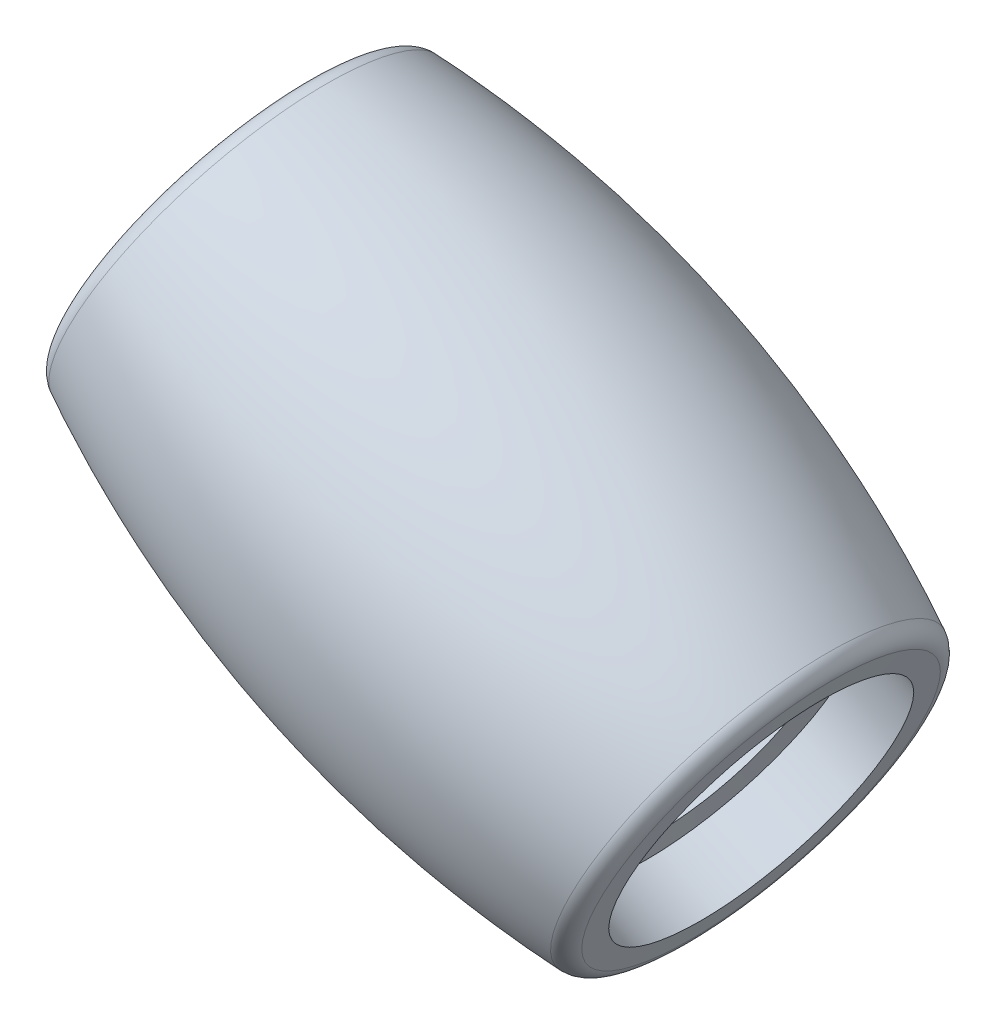
ISO-10303-21;
HEADER;
FILE_DESCRIPTION(('STEP AP214'),'2;1');
FILE_NAME('part.step','',(''),(''),'','','');
FILE_SCHEMA(('AUTOMOTIVE_DESIGN { 1 0 10303 214 1 1 1 1 }'));
ENDSEC;
DATA;
#1=APPLICATION_CONTEXT('core data for automotive mechanical design processes');
#2=APPLICATION_PROTOCOL_DEFINITION('international standard','automotive_design',2000,#1);
#3=PRODUCT_CONTEXT('',#1,'mechanical');
#4=PRODUCT('Part','Part','',(#3));
#5=PRODUCT_RELATED_PRODUCT_CATEGORY('part','',(#4));
#6=PRODUCT_DEFINITION_FORMATION('','',#4);
#7=PRODUCT_DEFINITION_CONTEXT('part definition',#1,'design');
#8=PRODUCT_DEFINITION('design','',#6,#7);
#9=PRODUCT_DEFINITION_SHAPE('','',#8);
#10=(LENGTH_UNIT() NAMED_UNIT(*) SI_UNIT(.MILLI.,.METRE.));
#11=(NAMED_UNIT(*) PLANE_ANGLE_UNIT() SI_UNIT($,.RADIAN.));
#12=(NAMED_UNIT(*) SI_UNIT($,.STERADIAN.) SOLID_ANGLE_UNIT());
#13=UNCERTAINTY_MEASURE_WITH_UNIT(LENGTH_MEASURE(1.E-05),#10,'distance_accuracy_value','');
#14=(GEOMETRIC_REPRESENTATION_CONTEXT(3) GLOBAL_UNCERTAINTY_ASSIGNED_CONTEXT((#13)) GLOBAL_UNIT_ASSIGNED_CONTEXT((#10,
#11,#12)) REPRESENTATION_CONTEXT('',''));
#15=CARTESIAN_POINT('',(0.,0.,0.));
#16=DIRECTION('',(0.,0.,1.));
#17=DIRECTION('',(1.,0.,0.));
#18=AXIS2_PLACEMENT_3D('',#15,#16,#17);
#19=CARTESIAN_POINT('',(-10.8636941727663,-21.4063109601022,0.));
#20=DIRECTION('',(0.900968867902419,-0.433883739117558,0.));
#21=DIRECTION('',(0.433883739117558,0.900968867902419,0.));
#22=AXIS2_PLACEMENT_3D('',#19,#20,#21);
#23=CONICAL_SURFACE('',#22,4.50000000006161,1.48352986419795);
#24=CARTESIAN_POINT('',(-10.8636941727726,-21.4063109600992,0.));
#25=DIRECTION('',(-0.900968867902419,0.433883739117558,0.));
#26=DIRECTION('',(-0.433883739117558,-0.900968867902419,0.));
#27=AXIS2_PLACEMENT_3D('',#24,#25,#26);
#28=CIRCLE('',#27,4.5);
#29=CARTESIAN_POINT('',(-12.8161709988016,-25.4606708656601,0.));
#30=VERTEX_POINT('',#29);
#31=EDGE_CURVE('E21',#30,#30,#28,.F.);
#32=ORIENTED_EDGE('',*,*,#31,.T.);
#33=EDGE_LOOP('',(#32));
#34=FACE_BOUND('',#33,.T.);
#35=CARTESIAN_POINT('',(-10.9819310159695,-21.3493710974077,0.));
#36=DIRECTION('',(-0.900968867902419,0.433883739117558,0.));
#37=DIRECTION('',(-0.433883739117558,-0.900968867902419,0.));
#38=AXIS2_PLACEMENT_3D('',#35,#36,#37);
#39=CIRCLE('',#38,3.);
#40=CARTESIAN_POINT('',(-12.2835822333222,-24.0522777011149,0.));
#41=VERTEX_POINT('',#40);
#42=EDGE_CURVE('E76',#41,#41,#39,.T.);
#43=ORIENTED_EDGE('',*,*,#42,.T.);
#44=EDGE_LOOP('',(#43));
#45=FACE_BOUND('',#44,.T.);
#46=ADVANCED_FACE('F17',(#34,#45),#23,.F.);
#47=CARTESIAN_POINT('',(-10.4132097388214,-21.623252829658,0.));
#48=DIRECTION('',(-0.900968867902419,0.433883739117558,0.));
#49=DIRECTION('',(-0.433883739117558,-0.900968867902419,0.));
#50=AXIS2_PLACEMENT_3D('',#47,#48,#49);
#51=CYLINDRICAL_SURFACE('',#50,4.5);
#52=CARTESIAN_POINT('',(-9.96272530487985,-21.8401946992121,0.));
#53=DIRECTION('',(-0.900968867902419,0.433883739117558,0.));
#54=DIRECTION('',(0.379720615811658,0.788497983452532,0.483821438155551));
#55=AXIS2_PLACEMENT_3D('',#52,#53,#54);
#56=CIRCLE('',#55,4.49999999995393);
#57=CARTESIAN_POINT('',(-8.25398253374487,-18.2919537737121,2.17719647167769));
#58=VERTEX_POINT('',#57);
#59=EDGE_CURVE('E74',#58,#58,#56,.F.);
#60=ORIENTED_EDGE('',*,*,#59,.T.);
#61=EDGE_LOOP('',(#60));
#62=FACE_BOUND('',#61,.T.);
#63=ORIENTED_EDGE('',*,*,#31,.F.);
#64=EDGE_LOOP('',(#63));
#65=FACE_BOUND('',#64,.T.);
#66=ADVANCED_FACE('F84',(#62,#65),#51,.F.);
#67=CARTESIAN_POINT('',(-12.2601959180214,-20.733791164467,0.));
#68=DIRECTION('',(-0.900968867902419,0.433883739117558,0.));
#69=DIRECTION('',(-0.433883739117558,-0.900968867902419,0.));
#70=AXIS2_PLACEMENT_3D('',#67,#68,#69);
#71=CYLINDRICAL_SURFACE('',#70,3.);
#72=ORIENTED_EDGE('',*,*,#42,.F.);
#73=EDGE_LOOP('',(#72));
#74=FACE_BOUND('',#73,.T.);
#75=CARTESIAN_POINT('',(-13.5384608200791,-20.1182112315235,0.));
#76=DIRECTION('',(-0.900968867902419,0.433883739117558,0.));
#77=DIRECTION('',(0.379720615811813,0.788497983452854,0.483821438154904));
#78=AXIS2_PLACEMENT_3D('',#75,#76,#77);
#79=CIRCLE('',#78,3.00000000001246);
#80=CARTESIAN_POINT('',(-12.3992989726389,-17.7527172811551,1.45146431447074));
#81=VERTEX_POINT('',#80);
#82=EDGE_CURVE('E71',#81,#81,#79,.T.);
#83=ORIENTED_EDGE('',*,*,#82,.T.);
#84=EDGE_LOOP('',(#83));
#85=FACE_BOUND('',#84,.T.);
#86=ADVANCED_FACE('F86',(#74,#85),#71,.F.);
#87=CARTESIAN_POINT('',(-9.96272530487985,-21.8401946992121,0.));
#88=DIRECTION('',(-0.900968867902419,0.433883739117558,0.));
#89=DIRECTION('',(-0.433883739117558,-0.900968867902419,0.));
#90=AXIS2_PLACEMENT_3D('',#87,#88,#89);
#91=CONICAL_SURFACE('',#90,4.49999999995394,1.48352986421008);
#92=ORIENTED_EDGE('',*,*,#59,.F.);
#93=EDGE_LOOP('',(#92));
#94=FACE_BOUND('',#93,.T.);
#95=CARTESIAN_POINT('',(-9.84448846167332,-21.8971345619083,0.));
#96=DIRECTION('',(-0.900968867902419,0.433883739117558,0.));
#97=DIRECTION('',(-0.433883739117558,-0.900968867902419,0.));
#98=AXIS2_PLACEMENT_3D('',#95,#96,#97);
#99=CIRCLE('',#98,3.);
#100=CARTESIAN_POINT('',(-11.146139679026,-24.6000411656156,0.));
#101=VERTEX_POINT('',#100);
#102=EDGE_CURVE('E68',#101,#101,#99,.F.);
#103=ORIENTED_EDGE('',*,*,#102,.T.);
#104=EDGE_LOOP('',(#103));
#105=FACE_BOUND('',#104,.T.);
#106=ADVANCED_FACE('F94',(#94,#105),#91,.F.);
#107=CARTESIAN_POINT('',(-13.6566976632872,-20.0612713688266,0.));
#108=DIRECTION('',(-0.900968867902419,0.433883739117558,0.));
#109=DIRECTION('',(-0.433883739117558,-0.900968867902419,0.));
#110=AXIS2_PLACEMENT_3D('',#107,#108,#109);
#111=CONICAL_SURFACE('',#110,4.50000000001495,1.4835298641935);
#112=CARTESIAN_POINT('',(-13.6566976632701,-20.0612713688348,0.));
#113=DIRECTION('',(-0.900968867902419,0.433883739117558,0.));
#114=DIRECTION('',(-0.433883739117558,-0.900968867902419,0.));
#115=AXIS2_PLACEMENT_3D('',#112,#113,#114);
#116=CIRCLE('',#115,4.5);
#117=CARTESIAN_POINT('',(-15.6091744892991,-24.1156312743957,0.));
#118=VERTEX_POINT('',#117);
#119=EDGE_CURVE('E65',#118,#118,#116,.T.);
#120=ORIENTED_EDGE('',*,*,#119,.T.);
#121=EDGE_LOOP('',(#120));
#122=FACE_BOUND('',#121,.T.);
#123=ORIENTED_EDGE('',*,*,#82,.F.);
#124=EDGE_LOOP('',(#123));
#125=FACE_BOUND('',#124,.T.);
#126=ADVANCED_FACE('F186',(#122,#125),#111,.F.);
#127=CARTESIAN_POINT('',(-8.56622355962145,-22.512714494849,0.));
#128=DIRECTION('',(-0.900968867902419,0.433883739117558,0.));
#129=DIRECTION('',(-0.433883739117558,-0.900968867902419,0.));
#130=AXIS2_PLACEMENT_3D('',#127,#128,#129);
#131=CYLINDRICAL_SURFACE('',#130,3.);
#132=ORIENTED_EDGE('',*,*,#102,.F.);
#133=EDGE_LOOP('',(#132));
#134=FACE_BOUND('',#133,.T.);
#135=CARTESIAN_POINT('',(-7.28795865756539,-23.1282944277917,0.));
#136=DIRECTION('',(0.900968867902419,-0.433883739117558,0.));
#137=DIRECTION('',(-0.379720615814094,-0.788497983457589,-0.483821438145397));
#138=AXIS2_PLACEMENT_3D('',#135,#136,#137);
#139=CIRCLE('',#138,2.9999999999539);
#140=CARTESIAN_POINT('',(-8.42712050499017,-25.4937883781281,-1.4514643144139));
#141=VERTEX_POINT('',#140);
#142=EDGE_CURVE('E57',#141,#141,#139,.T.);
#143=ORIENTED_EDGE('',*,*,#142,.T.);
#144=EDGE_LOOP('',(#143));
#145=FACE_BOUND('',#144,.T.);
#146=ADVANCED_FACE('F183',(#134,#145),#131,.F.);
#147=CARTESIAN_POINT('',(-14.1071820972213,-19.844329499276,0.));
#148=DIRECTION('',(-0.900968867902419,0.433883739117558,0.));
#149=DIRECTION('',(-0.433883739117558,-0.900968867902419,0.));
#150=AXIS2_PLACEMENT_3D('',#147,#148,#149);
#151=CYLINDRICAL_SURFACE('',#150,4.5);
#152=CARTESIAN_POINT('',(-14.5576665311737,-19.6273876297167,0.));
#153=DIRECTION('',(0.900968867902419,-0.433883739117558,0.));
#154=DIRECTION('',(-0.379720615814473,-0.788497983458377,-0.483821438143816));
#155=AXIS2_PLACEMENT_3D('',#152,#153,#154);
#156=CIRCLE('',#155,4.49999999994559);
#157=CARTESIAN_POINT('',(-16.2664093023842,-23.175628555363,-2.17719647172327));
#158=VERTEX_POINT('',#157);
#159=CARTESIAN_POINT('',(-12.8489237600541,-16.0791467042325,2.17719647162675));
#160=VERTEX_POINT('',#159);
#161=EDGE_CURVE('E47',#158,#160,#156,.F.);
#162=ORIENTED_EDGE('',*,*,#161,.T.);
#163=CARTESIAN_POINT('',(-14.5576665311737,-19.6273876297167,0.));
#164=DIRECTION('',(0.900968867902419,-0.433883739117558,0.));
#165=DIRECTION('',(-0.379720615814473,-0.788497983458377,-0.483821438143816));
#166=AXIS2_PLACEMENT_3D('',#163,#164,#165);
#167=CIRCLE('',#166,4.49999999994559);
#168=EDGE_CURVE('E42',#160,#158,#167,.F.);
#169=ORIENTED_EDGE('',*,*,#168,.T.);
#170=EDGE_LOOP('',(#162,#169));
#171=FACE_BOUND('',#170,.T.);
#172=ORIENTED_EDGE('',*,*,#119,.F.);
#173=EDGE_LOOP('',(#172));
#174=FACE_BOUND('',#173,.T.);
#175=ADVANCED_FACE('F55',(#171,#174),#151,.F.);
#176=CARTESIAN_POINT('',(-7.16972181438121,-23.1852342904771,0.));
#177=DIRECTION('',(0.900968867902419,-0.433883739117558,0.));
#178=DIRECTION('',(0.433883739117558,0.900968867902419,0.));
#179=AXIS2_PLACEMENT_3D('',#176,#177,#178);
#180=CONICAL_SURFACE('',#179,4.5000000000778,1.48352986421167);
#181=ORIENTED_EDGE('',*,*,#142,.F.);
#182=EDGE_LOOP('',(#181));
#183=FACE_BOUND('',#182,.T.);
#184=CARTESIAN_POINT('',(-7.16972181437269,-23.1852342904812,0.));
#185=DIRECTION('',(-0.900968867902419,0.433883739117558,0.));
#186=DIRECTION('',(-0.433883739117558,-0.900968867902419,0.));
#187=AXIS2_PLACEMENT_3D('',#184,#185,#186);
#188=CIRCLE('',#187,4.5);
#189=CARTESIAN_POINT('',(-9.1221986404017,-27.2395941960421,0.));
#190=VERTEX_POINT('',#189);
#191=EDGE_CURVE('E155',#190,#190,#188,.F.);
#192=ORIENTED_EDGE('',*,*,#191,.T.);
#193=EDGE_LOOP('',(#192));
#194=FACE_BOUND('',#193,.T.);
#195=ADVANCED_FACE('F159',(#183,#194),#180,.F.);
#196=CARTESIAN_POINT('',(-14.5576665311523,-19.627387629727,0.));
#197=DIRECTION('',(0.900968867902419,-0.433883739117558,0.));
#198=DIRECTION('',(0.433883739117558,0.900968867902419,0.));
#199=AXIS2_PLACEMENT_3D('',#196,#197,#198);
#200=CONICAL_SURFACE('',#199,4.50000000007353,1.4835298641705);
#201=DIRECTION('',(-0.456800275099482,-0.747682051019643,-0.481980351520782));
#202=VECTOR('',#201,1.);
#203=CARTESIAN_POINT('',(276835.395805853,453123.891917337,292111.051876179));
#204=LINE('',#203,#202);
#205=CARTESIAN_POINT('',(-13.5367415269888,-17.2049538167969,1.45146431431165));
#206=VERTEX_POINT('',#205);
#207=EDGE_CURVE('E52',#160,#206,#204,.T.);
#208=ORIENTED_EDGE('',*,*,#207,.T.);
#209=CARTESIAN_POINT('',(-14.6759033743694,-19.5704477670257,0.));
#210=DIRECTION('',(-0.900968867902419,0.433883739117558,0.));
#211=DIRECTION('',(-0.433883739117558,-0.900968867902419,0.));
#212=AXIS2_PLACEMENT_3D('',#209,#210,#211);
#213=CIRCLE('',#212,3.);
#214=CARTESIAN_POINT('',(-15.8150652218076,-21.9359417173605,-1.45146431442534));
#215=VERTEX_POINT('',#214);
#216=EDGE_CURVE('E36',#206,#215,#213,.T.);
#217=ORIENTED_EDGE('',*,*,#216,.T.);
#218=DIRECTION('',(0.299751053354882,0.823312970121067,0.481980351511414));
#219=VECTOR('',#218,1.);
#220=CARTESIAN_POINT('',(-181683.30450178,-499000.,-292111.051870502));
#221=LINE('',#220,#219);
#222=EDGE_CURVE('E50',#215,#158,#221,.F.);
#223=ORIENTED_EDGE('',*,*,#222,.T.);
#224=ORIENTED_EDGE('',*,*,#168,.F.);
#225=EDGE_LOOP('',(#208,#217,#223,#224));
#226=FACE_BOUND('',#225,.T.);
#227=ADVANCED_FACE('F59',(#226),#200,.F.);
#228=CARTESIAN_POINT('',(-14.5576665311523,-19.627387629727,0.));
#229=DIRECTION('',(0.900968867902419,-0.433883739117558,0.));
#230=DIRECTION('',(0.433883739117558,0.900968867902419,0.));
#231=AXIS2_PLACEMENT_3D('',#228,#229,#230);
#232=CONICAL_SURFACE('',#231,4.50000000007353,1.48352986418336);
#233=CARTESIAN_POINT('',(-14.6759033743694,-19.5704477670257,0.));
#234=DIRECTION('',(-0.900968867902419,0.433883739117558,0.));
#235=DIRECTION('',(-0.433883739117558,-0.900968867902419,0.));
#236=AXIS2_PLACEMENT_3D('',#233,#234,#235);
#237=CIRCLE('',#236,3.);
#238=EDGE_CURVE('E152',#215,#206,#237,.T.);
#239=ORIENTED_EDGE('',*,*,#238,.T.);
#240=ORIENTED_EDGE('',*,*,#207,.F.);
#241=ORIENTED_EDGE('',*,*,#161,.F.);
#242=ORIENTED_EDGE('',*,*,#222,.F.);
#243=EDGE_LOOP('',(#239,#240,#241,#242));
#244=FACE_BOUND('',#243,.T.);
#245=ADVANCED_FACE('F49',(#244),#232,.F.);
#246=CARTESIAN_POINT('',(-6.71923738042148,-23.40217616004,0.));
#247=DIRECTION('',(-0.900968867902419,0.433883739117558,0.));
#248=DIRECTION('',(-0.433883739117558,-0.900968867902419,0.));
#249=AXIS2_PLACEMENT_3D('',#246,#247,#248);
#250=CYLINDRICAL_SURFACE('',#249,4.5);
#251=CARTESIAN_POINT('',(-6.2687529464708,-23.6191180295985,0.));
#252=DIRECTION('',(-0.900968867902419,0.433883739117558,0.));
#253=DIRECTION('',(0.379720615812953,0.78849798345522,0.483821438150154));
#254=AXIS2_PLACEMENT_3D('',#251,#252,#253);
#255=CIRCLE('',#254,4.50000000000415);
#256=CARTESIAN_POINT('',(-4.56001017531094,-20.0708771040468,2.17719647167769));
#257=VERTEX_POINT('',#256);
#258=EDGE_CURVE('E149',#257,#257,#255,.F.);
#259=ORIENTED_EDGE('',*,*,#258,.T.);
#260=EDGE_LOOP('',(#259));
#261=FACE_BOUND('',#260,.T.);
#262=ORIENTED_EDGE('',*,*,#191,.F.);
#263=EDGE_LOOP('',(#262));
#264=FACE_BOUND('',#263,.T.);
#265=ADVANCED_FACE('F161',(#261,#264),#250,.F.);
#266=CARTESIAN_POINT('',(-15.3265838298847,-19.2570965746954,0.));
#267=DIRECTION('',(-0.900968867902419,0.433883739117558,0.));
#268=DIRECTION('',(-0.433883739117558,-0.900968867902419,0.));
#269=AXIS2_PLACEMENT_3D('',#266,#267,#268);
#270=CYLINDRICAL_SURFACE('',#269,3.);
#271=ORIENTED_EDGE('',*,*,#216,.F.);
#272=ORIENTED_EDGE('',*,*,#238,.F.);
#273=EDGE_LOOP('',(#271,#272));
#274=FACE_BOUND('',#273,.T.);
#275=CARTESIAN_POINT('',(-15.9772642853865,-18.9437453823716,0.));
#276=DIRECTION('',(-0.900968867902419,0.433883739117558,0.));
#277=DIRECTION('',(0.379720615811614,0.78849798345244,0.483821438155736));
#278=AXIS2_PLACEMENT_3D('',#275,#276,#277);
#279=CIRCLE('',#278,3.0000000000073);
#280=CARTESIAN_POINT('',(-14.8381024379489,-16.5782514320085,1.45146431447074));
#281=VERTEX_POINT('',#280);
#282=EDGE_CURVE('E146',#281,#281,#279,.T.);
#283=ORIENTED_EDGE('',*,*,#282,.T.);
#284=EDGE_LOOP('',(#283));
#285=FACE_BOUND('',#284,.T.);
#286=ADVANCED_FACE('F163',(#274,#285),#270,.F.);
#287=CARTESIAN_POINT('',(-6.26875294647165,-23.6191180295981,0.));
#288=DIRECTION('',(-0.900968867902419,0.433883739117558,0.));
#289=DIRECTION('',(-0.433883739117558,-0.900968867902419,0.));
#290=AXIS2_PLACEMENT_3D('',#287,#288,#289);
#291=CONICAL_SURFACE('',#290,4.49999999992103,1.4835298641951);
#292=ORIENTED_EDGE('',*,*,#258,.F.);
#293=EDGE_LOOP('',(#292));
#294=FACE_BOUND('',#293,.T.);
#295=CARTESIAN_POINT('',(-6.1505161032734,-23.6760578922903,0.));
#296=DIRECTION('',(-0.900968867902419,0.433883739117558,0.));
#297=DIRECTION('',(-0.433883739117558,-0.900968867902419,0.));
#298=AXIS2_PLACEMENT_3D('',#295,#296,#297);
#299=CIRCLE('',#298,3.);
#300=CARTESIAN_POINT('',(-7.45216732062608,-26.3789644959976,0.));
#301=VERTEX_POINT('',#300);
#302=EDGE_CURVE('E143',#301,#301,#299,.F.);
#303=ORIENTED_EDGE('',*,*,#302,.T.);
#304=EDGE_LOOP('',(#303));
#305=FACE_BOUND('',#304,.T.);
#306=ADVANCED_FACE('F170',(#294,#305),#291,.F.);
#307=CARTESIAN_POINT('',(-16.0442651631615,-18.9114794601973,0.));
#308=DIRECTION('',(-0.900968867902419,0.433883739117558,0.));
#309=DIRECTION('',(-0.433883739117558,-0.900968867902419,0.));
#310=AXIS2_PLACEMENT_3D('',#307,#308,#309);
#311=CONICAL_SURFACE('',#310,3.84999999976031,1.48352986419769);
#312=CARTESIAN_POINT('',(-16.0442651632115,-18.9114794601733,0.));
#313=DIRECTION('',(-0.900968867902419,0.433883739117558,0.));
#314=DIRECTION('',(-0.433883739117558,-0.900968867902419,0.));
#315=AXIS2_PLACEMENT_3D('',#312,#313,#314);
#316=CIRCLE('',#315,3.85);
#317=CARTESIAN_POINT('',(-17.7147175588141,-22.3802096015976,0.));
#318=VERTEX_POINT('',#317);
#319=EDGE_CURVE('E140',#318,#318,#316,.T.);
#320=ORIENTED_EDGE('',*,*,#319,.T.);
#321=EDGE_LOOP('',(#320));
#322=FACE_BOUND('',#321,.T.);
#323=ORIENTED_EDGE('',*,*,#282,.F.);
#324=EDGE_LOOP('',(#323));
#325=FACE_BOUND('',#324,.T.);
#326=ADVANCED_FACE('F250',(#322,#325),#311,.F.);
#327=CARTESIAN_POINT('',(-5.49983564775813,-23.9894090846206,0.));
#328=DIRECTION('',(-0.900968867902419,0.433883739117558,0.));
#329=DIRECTION('',(-0.433883739117558,-0.900968867902419,0.));
#330=AXIS2_PLACEMENT_3D('',#327,#328,#329);
#331=CYLINDRICAL_SURFACE('',#330,3.);
#332=ORIENTED_EDGE('',*,*,#302,.F.);
#333=EDGE_LOOP('',(#332));
#334=FACE_BOUND('',#333,.T.);
#335=CARTESIAN_POINT('',(-4.8491551922571,-24.302760276944,0.));
#336=DIRECTION('',(0.900968867902419,-0.433883739117558,0.));
#337=DIRECTION('',(-0.379720615811743,-0.788497983452708,-0.483821438155198));
#338=AXIS2_PLACEMENT_3D('',#335,#336,#337);
#339=CIRCLE('',#338,2.99999999989313);
#340=CARTESIAN_POINT('',(-5.98831703965175,-26.6682542272179,-1.4514643144139));
#341=VERTEX_POINT('',#340);
#342=EDGE_CURVE('E137',#341,#341,#339,.T.);
#343=ORIENTED_EDGE('',*,*,#342,.T.);
#344=EDGE_LOOP('',(#343));
#345=FACE_BOUND('',#344,.T.);
#346=ADVANCED_FACE('F259',(#334,#345),#331,.F.);
#347=CARTESIAN_POINT('',(-16.4622005143181,-18.7102124027779,0.));
#348=DIRECTION('',(-0.900968867902419,0.433883739117558,0.));
#349=DIRECTION('',(-0.433883739117558,-0.900968867902419,0.));
#350=AXIS2_PLACEMENT_3D('',#347,#348,#349);
#351=CYLINDRICAL_SURFACE('',#350,3.85);
#352=CARTESIAN_POINT('',(-16.8801358654306,-18.5089453453797,0.));
#353=DIRECTION('',(0.900968867902419,-0.433883739117558,0.));
#354=DIRECTION('',(-0.379720615812817,-0.788497983454938,-0.48382143815072));
#355=AXIS2_PLACEMENT_3D('',#352,#353,#354);
#356=CIRCLE('',#355,3.8499999999925);
#357=CARTESIAN_POINT('',(-18.3420602363071,-21.5446625816753,-1.86271253687664));
#358=VERTEX_POINT('',#357);
#359=EDGE_CURVE('E134',#358,#358,#356,.F.);
#360=ORIENTED_EDGE('',*,*,#359,.T.);
#361=EDGE_LOOP('',(#360));
#362=FACE_BOUND('',#361,.T.);
#363=ORIENTED_EDGE('',*,*,#319,.F.);
#364=EDGE_LOOP('',(#363));
#365=FACE_BOUND('',#364,.T.);
#366=ADVANCED_FACE('F269',(#362,#365),#351,.F.);
#367=CARTESIAN_POINT('',(-4.78215431440174,-24.335026199157,0.));
#368=DIRECTION('',(0.900968867902419,-0.433883739117558,0.));
#369=DIRECTION('',(0.433883739117558,0.900968867902419,0.));
#370=AXIS2_PLACEMENT_3D('',#367,#368,#369);
#371=CONICAL_SURFACE('',#370,3.85000000062907,1.48352986419896);
#372=CARTESIAN_POINT('',(-4.78215431443128,-24.3350261991427,0.));
#373=DIRECTION('',(-0.900968867902419,0.433883739117558,0.));
#374=DIRECTION('',(-0.433883739117558,-0.900968867902419,0.));
#375=AXIS2_PLACEMENT_3D('',#372,#373,#374);
#376=CIRCLE('',#375,3.85000000000001);
#377=CARTESIAN_POINT('',(-6.45260671003388,-27.8037563405671,0.));
#378=VERTEX_POINT('',#377);
#379=EDGE_CURVE('E131',#378,#378,#376,.F.);
#380=ORIENTED_EDGE('',*,*,#379,.T.);
#381=EDGE_LOOP('',(#380));
#382=FACE_BOUND('',#381,.T.);
#383=ORIENTED_EDGE('',*,*,#342,.F.);
#384=EDGE_LOOP('',(#383));
#385=FACE_BOUND('',#384,.T.);
#386=ADVANCED_FACE('F279',(#382,#385),#371,.F.);
#387=CARTESIAN_POINT('',(-16.8801358654374,-18.5089453453764,0.));
#388=DIRECTION('',(0.900968867902419,-0.433883739117558,0.));
#389=DIRECTION('',(0.433883739117558,0.900968867902419,0.));
#390=AXIS2_PLACEMENT_3D('',#387,#388,#389);
#391=CONICAL_SURFACE('',#390,3.85000000054742,1.56206968054265);
#392=ORIENTED_EDGE('',*,*,#359,.F.);
#393=EDGE_LOOP('',(#392));
#394=FACE_BOUND('',#393,.T.);
#395=CARTESIAN_POINT('',(-16.8958611378123,-18.5013724533269,0.));
#396=DIRECTION('',(-0.900968867902419,0.433883739117558,0.));
#397=DIRECTION('',(-0.433883739117558,-0.900968867902419,0.));
#398=AXIS2_PLACEMENT_3D('',#395,#396,#397);
#399=CIRCLE('',#398,1.85);
#400=CARTESIAN_POINT('',(-17.6985460551797,-20.1681648589464,0.));
#401=VERTEX_POINT('',#400);
#402=EDGE_CURVE('E128',#401,#401,#399,.T.);
#403=ORIENTED_EDGE('',*,*,#402,.T.);
#404=EDGE_LOOP('',(#403));
#405=FACE_BOUND('',#404,.T.);
#406=ADVANCED_FACE('F289',(#394,#405),#391,.F.);
#407=CARTESIAN_POINT('',(-4.03885499841178,-24.6929802839147,0.));
#408=DIRECTION('',(-0.900968867902419,0.433883739117558,0.));
#409=DIRECTION('',(-0.433883739117558,-0.900968867902419,0.));
#410=AXIS2_PLACEMENT_3D('',#407,#408,#409);
#411=CYLINDRICAL_SURFACE('',#410,3.85000000000001);
#412=ORIENTED_EDGE('',*,*,#379,.F.);
#413=EDGE_LOOP('',(#412));
#414=FACE_BOUND('',#413,.T.);
#415=CARTESIAN_POINT('',(-3.29555568237297,-25.050934368696,0.));
#416=DIRECTION('',(-0.900968867902419,0.433883739117558,0.));
#417=DIRECTION('',(0.37972061580911,0.78849798344724,0.483821438166175));
#418=AXIS2_PLACEMENT_3D('',#415,#416,#417);
#419=CIRCLE('',#418,3.84999999998703);
#420=CARTESIAN_POINT('',(-1.83363131151282,-22.0152171324344,1.86271253693349));
#421=VERTEX_POINT('',#420);
#422=EDGE_CURVE('E125',#421,#421,#419,.T.);
#423=ORIENTED_EDGE('',*,*,#422,.F.);
#424=EDGE_LOOP('',(#423));
#425=FACE_BOUND('',#424,.T.);
#426=ADVANCED_FACE('F299',(#414,#425),#411,.F.);
#427=CARTESIAN_POINT('',(-17.3463455717635,-18.2844305837681,0.));
#428=DIRECTION('',(-0.900968867902419,0.433883739117558,0.));
#429=DIRECTION('',(-0.433883739117558,-0.900968867902419,0.));
#430=AXIS2_PLACEMENT_3D('',#427,#428,#429);
#431=CYLINDRICAL_SURFACE('',#430,1.85);
#432=ORIENTED_EDGE('',*,*,#402,.F.);
#433=EDGE_LOOP('',(#432));
#434=FACE_BOUND('',#433,.T.);
#435=CARTESIAN_POINT('',(-17.7968300057022,-18.0674887142153,0.));
#436=DIRECTION('',(0.900968867902419,-0.433883739117558,0.));
#437=DIRECTION('',(-0.379720615810827,-0.788497983450806,-0.483821438159016));
#438=AXIS2_PLACEMENT_3D('',#435,#436,#437);
#439=CIRCLE('',#438,1.85000000001351);
#440=CARTESIAN_POINT('',(-18.4993131449573,-19.52620998361,-0.895069660600711));
#441=VERTEX_POINT('',#440);
#442=EDGE_CURVE('E122',#441,#441,#439,.T.);
#443=ORIENTED_EDGE('',*,*,#442,.F.);
#444=EDGE_LOOP('',(#443));
#445=FACE_BOUND('',#444,.T.);
#446=ADVANCED_FACE('F309',(#434,#445),#431,.F.);
#447=CARTESIAN_POINT('',(-3.30087362285668,-25.0483733835347,0.));
#448=DIRECTION('',(-0.900968867902419,0.433883739117558,0.));
#449=DIRECTION('',(-0.433883739117558,-0.900968867902419,0.));
#450=AXIS2_PLACEMENT_3D('',#447,#448,#449);
#451=CONICAL_SURFACE('',#450,4.52635591333843,1.56206968053717);
#452=CARTESIAN_POINT('',(-3.30087362287696,-25.048373383525,0.));
#453=DIRECTION('',(-0.900968867902419,0.433883739117558,0.));
#454=DIRECTION('',(0.379720615812218,0.788497983453693,0.48382143815322));
#455=AXIS2_PLACEMENT_3D('',#452,#453,#454);
#456=CIRCLE('',#455,4.52635591341333);
#457=CARTESIAN_POINT('',(-1.58212296805038,-21.4793508734048,2.18994802762096));
#458=VERTEX_POINT('',#457);
#459=EDGE_CURVE('E119',#458,#458,#456,.T.);
#460=ORIENTED_EDGE('',*,*,#459,.F.);
#461=EDGE_LOOP('',(#460));
#462=FACE_BOUND('',#461,.T.);
#463=ORIENTED_EDGE('',*,*,#422,.T.);
#464=EDGE_LOOP('',(#463));
#465=FACE_BOUND('',#464,.T.);
#466=ADVANCED_FACE('F319',(#462,#465),#451,.T.);
#467=CARTESIAN_POINT('',(-17.7757867928193,-18.0776225914379,0.));
#468=DIRECTION('',(0.900968867902419,-0.433883739117558,0.));
#469=DIRECTION('',(0.433883739117558,0.900968867902419,0.));
#470=AXIS2_PLACEMENT_3D('',#467,#468,#469);
#471=CONICAL_SURFACE('',#470,4.52635591455475,1.56206968053465);
#472=CARTESIAN_POINT('',(-17.7757867928381,-18.0776225914289,0.));
#473=DIRECTION('',(0.900968867902419,-0.433883739117558,0.));
#474=DIRECTION('',(0.379720615812218,0.788497983453693,0.48382143815322));
#475=AXIS2_PLACEMENT_3D('',#472,#473,#474);
#476=CIRCLE('',#475,4.52635591396753);
#477=CARTESIAN_POINT('',(-16.0570361378011,-14.5086000808718,2.18994802788911));
#478=VERTEX_POINT('',#477);
#479=EDGE_CURVE('E116',#478,#478,#476,.T.);
#480=ORIENTED_EDGE('',*,*,#479,.F.);
#481=EDGE_LOOP('',(#480));
#482=FACE_BOUND('',#481,.T.);
#483=ORIENTED_EDGE('',*,*,#442,.T.);
#484=EDGE_LOOP('',(#483));
#485=FACE_BOUND('',#484,.T.);
#486=ADVANCED_FACE('F110',(#482,#485),#471,.T.);
#487=CARTESIAN_POINT('',(-3.75134090376018,-24.8314397744484,0.));
#488=DIRECTION('',(-0.900968867902419,0.433883739117558,0.));
#489=DIRECTION('',(-0.433883739117558,-0.900968867902419,0.));
#490=AXIS2_PLACEMENT_3D('',#487,#488,#489);
#491=TOROIDAL_SURFACE('',#490,4.521992645522,0.500000000000003);
#492=CARTESIAN_POINT('',(-3.63630718674153,-24.8868370928716,0.));
#493=DIRECTION('',(-0.900968867902419,0.433883739117558,0.));
#494=DIRECTION('',(0.379720615812217,0.788497983453693,0.483821438153221));
#495=AXIS2_PLACEMENT_3D('',#492,#493,#494);
#496=CIRCLE('',#495,5.0054162496834);
#497=CARTESIAN_POINT('',(-1.73564744601527,-20.9400764736499,2.42172768847731));
#498=VERTEX_POINT('',#497);
#499=EDGE_CURVE('E27',#498,#498,#496,.T.);
#500=ORIENTED_EDGE('',*,*,#499,.F.);
#501=EDGE_LOOP('',(#500));
#502=FACE_BOUND('',#501,.T.);
#503=ORIENTED_EDGE('',*,*,#459,.T.);
#504=EDGE_LOOP('',(#503));
#505=FACE_BOUND('',#504,.T.);
#506=ADVANCED_FACE('F105',(#502,#505),#491,.T.);
#507=CARTESIAN_POINT('',(-17.3253195119592,-18.2945562005034,0.));
#508=DIRECTION('',(-0.900968867902419,0.433883739117558,0.));
#509=DIRECTION('',(-0.433883739117558,-0.900968867902419,0.));
#510=AXIS2_PLACEMENT_3D('',#507,#508,#509);
#511=TOROIDAL_SURFACE('',#510,4.521992645522,0.500000000000001);
#512=ORIENTED_EDGE('',*,*,#479,.T.);
#513=EDGE_LOOP('',(#512));
#514=FACE_BOUND('',#513,.T.);
#515=CARTESIAN_POINT('',(-17.4403532289779,-18.2391588820801,0.));
#516=DIRECTION('',(-0.900968867902419,0.433883739117558,0.));
#517=DIRECTION('',(0.379720615812217,0.788497983453693,0.483821438153221));
#518=AXIS2_PLACEMENT_3D('',#515,#516,#517);
#519=CIRCLE('',#518,5.0054162496834);
#520=CARTESIAN_POINT('',(-15.5396934882516,-14.2923982628584,2.42172768847732));
#521=VERTEX_POINT('',#520);
#522=EDGE_CURVE('E11',#521,#521,#519,.F.);
#523=ORIENTED_EDGE('',*,*,#522,.F.);
#524=EDGE_LOOP('',(#523));
#525=FACE_BOUND('',#524,.T.);
#526=ADVANCED_FACE('F19',(#514,#525),#511,.T.);
#527=CARTESIAN_POINT('',(-19.651624987353,-40.4869495903646,-11.6117145156774));
#528=DIRECTION('',(0.209922254651153,0.435908053399827,-0.875166736104241));
#529=DIRECTION('',(0.379720615812217,0.788497983453693,0.48382143815322));
#530=AXIS2_PLACEMENT_3D('',#527,#528,#529);
#531=CIRCLE('',#530,30.0000000000002);
#532=TRIMMED_CURVE('',#531,(PARAMETER_VALUE(-0.643501108793282)),
(PARAMETER_VALUE(0.643501108793283)),.T.,.PARAMETER.);
#533=CARTESIAN_POINT('',(-10.5383302078597,-21.5629979874759,0.));
#534=DIRECTION('',(-0.900968867902419,0.433883739117558,0.));
#535=AXIS1_PLACEMENT('',#533,#534);
#536=SURFACE_OF_REVOLUTION('',#532,#535);
#537=ORIENTED_EDGE('',*,*,#522,.T.);
#538=EDGE_LOOP('',(#537));
#539=FACE_BOUND('',#538,.T.);
#540=ORIENTED_EDGE('',*,*,#499,.T.);
#541=EDGE_LOOP('',(#540));
#542=FACE_BOUND('',#541,.T.);
#543=ADVANCED_FACE('F98',(#539,#542),#536,.F.);
#544=CLOSED_SHELL('',(#46,#66,#86,#106,#126,#146,#175,#195,#227,#245,#265,#286,#306,#326,#346,
#366,#386,#406,#426,#446,#466,#486,#506,#526,#543));
#545=MANIFOLD_SOLID_BREP('B1',#544);
#546=ADVANCED_BREP_SHAPE_REPRESENTATION('',(#18,#545),#14);
#547=SHAPE_DEFINITION_REPRESENTATION(#9,#546);
ENDSEC;
END-ISO-10303-21;
